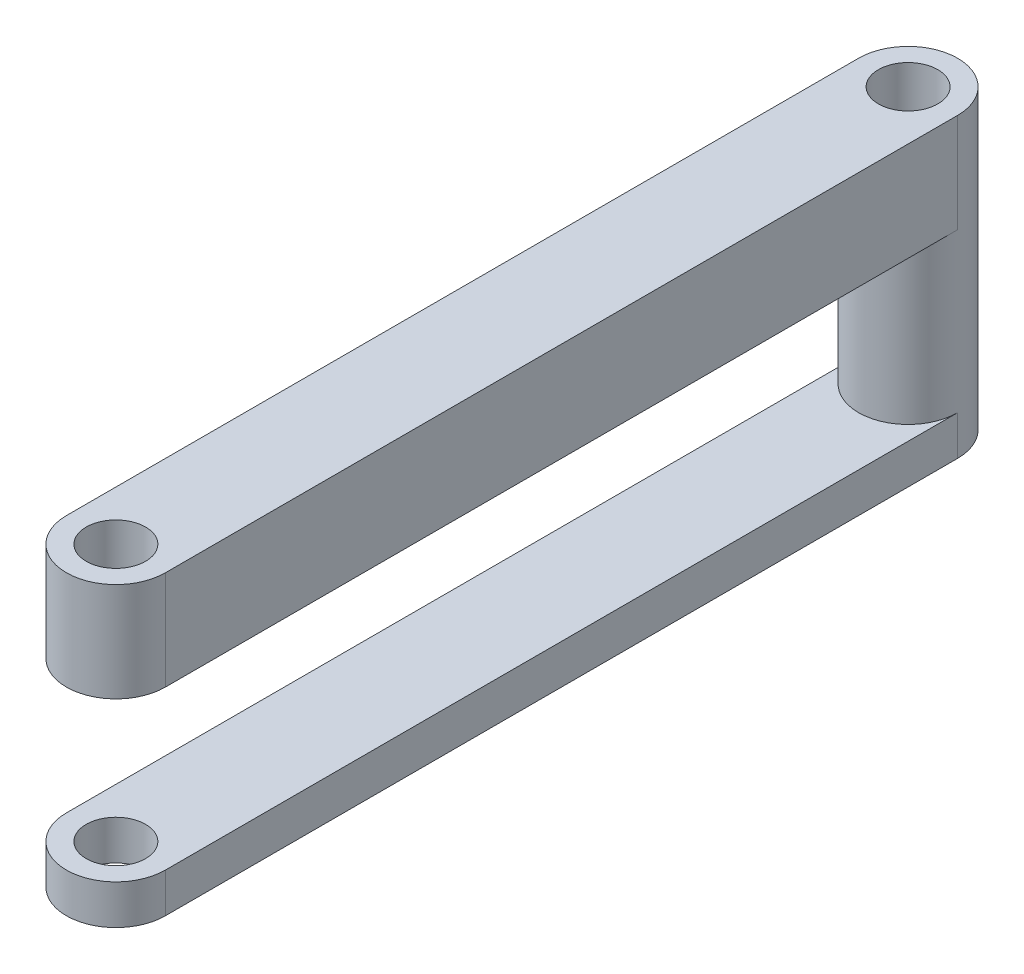
ISO-10303-21;
HEADER;
FILE_DESCRIPTION(('STEP AP214'),'2;1');
FILE_NAME('part.step','',(''),(''),'','','');
FILE_SCHEMA(('AUTOMOTIVE_DESIGN { 1 0 10303 214 1 1 1 1 }'));
ENDSEC;
DATA;
#1=APPLICATION_CONTEXT('core data for automotive mechanical design processes');
#2=APPLICATION_PROTOCOL_DEFINITION('international standard','automotive_design',2000,#1);
#3=PRODUCT_CONTEXT('',#1,'mechanical');
#4=PRODUCT('Part','Part','',(#3));
#5=PRODUCT_RELATED_PRODUCT_CATEGORY('part','',(#4));
#6=PRODUCT_DEFINITION_FORMATION('','',#4);
#7=PRODUCT_DEFINITION_CONTEXT('part definition',#1,'design');
#8=PRODUCT_DEFINITION('design','',#6,#7);
#9=PRODUCT_DEFINITION_SHAPE('','',#8);
#10=(LENGTH_UNIT() NAMED_UNIT(*) SI_UNIT(.MILLI.,.METRE.));
#11=(NAMED_UNIT(*) PLANE_ANGLE_UNIT() SI_UNIT($,.RADIAN.));
#12=(NAMED_UNIT(*) SI_UNIT($,.STERADIAN.) SOLID_ANGLE_UNIT());
#13=UNCERTAINTY_MEASURE_WITH_UNIT(LENGTH_MEASURE(1.E-05),#10,'distance_accuracy_value','');
#14=(GEOMETRIC_REPRESENTATION_CONTEXT(3) GLOBAL_UNCERTAINTY_ASSIGNED_CONTEXT((#13)) GLOBAL_UNIT_ASSIGNED_CONTEXT((#10,
#11,#12)) REPRESENTATION_CONTEXT('',''));
#15=CARTESIAN_POINT('',(0.,0.,0.));
#16=DIRECTION('',(0.,0.,1.));
#17=DIRECTION('',(1.,0.,0.));
#18=AXIS2_PLACEMENT_3D('',#15,#16,#17);
#19=CARTESIAN_POINT('',(0.,2.,0.));
#20=DIRECTION('',(0.,-1.,0.));
#21=DIRECTION('',(0.,0.,-1.));
#22=AXIS2_PLACEMENT_3D('',#19,#20,#21);
#23=CYLINDRICAL_SURFACE('',#22,2.5);
#24=CARTESIAN_POINT('',(0.,0.,0.));
#25=DIRECTION('',(0.,1.,0.));
#26=DIRECTION('',(0.,0.,1.));
#27=AXIS2_PLACEMENT_3D('',#24,#25,#26);
#28=CIRCLE('',#27,2.5);
#29=CARTESIAN_POINT('',(2.5,0.,0.));
#30=VERTEX_POINT('',#29);
#31=CARTESIAN_POINT('',(-2.5,0.,0.));
#32=VERTEX_POINT('',#31);
#33=EDGE_CURVE('E112',#30,#32,#28,.T.);
#34=ORIENTED_EDGE('',*,*,#33,.T.);
#35=DIRECTION('',(0.,-1.,0.));
#36=VECTOR('',#35,1.);
#37=CARTESIAN_POINT('',(-2.5,2.,0.));
#38=LINE('',#37,#36);
#39=CARTESIAN_POINT('',(-2.5,2.,0.));
#40=VERTEX_POINT('',#39);
#41=EDGE_CURVE('E123',#40,#32,#38,.T.);
#42=ORIENTED_EDGE('',*,*,#41,.F.);
#43=CARTESIAN_POINT('',(0.,2.,0.));
#44=DIRECTION('',(0.,1.,0.));
#45=DIRECTION('',(0.,0.,1.));
#46=AXIS2_PLACEMENT_3D('',#43,#44,#45);
#47=CIRCLE('',#46,2.5);
#48=CARTESIAN_POINT('',(2.5,2.,0.));
#49=VERTEX_POINT('',#48);
#50=EDGE_CURVE('E41',#40,#49,#47,.T.);
#51=ORIENTED_EDGE('',*,*,#50,.T.);
#52=DIRECTION('',(0.,-1.,0.));
#53=VECTOR('',#52,1.);
#54=CARTESIAN_POINT('',(2.5,2.,0.));
#55=LINE('',#54,#53);
#56=EDGE_CURVE('E131',#49,#30,#55,.T.);
#57=ORIENTED_EDGE('',*,*,#56,.T.);
#58=EDGE_LOOP('',(#34,#42,#51,#57));
#59=FACE_BOUND('',#58,.T.);
#60=CARTESIAN_POINT('',(0.,10.,0.));
#61=DIRECTION('',(0.,1.,0.));
#62=DIRECTION('',(0.,0.,1.));
#63=AXIS2_PLACEMENT_3D('',#60,#61,#62);
#64=CIRCLE('',#63,2.5);
#65=CARTESIAN_POINT('',(-2.5,10.,0.));
#66=VERTEX_POINT('',#65);
#67=CARTESIAN_POINT('',(2.5,10.,0.));
#68=VERTEX_POINT('',#67);
#69=EDGE_CURVE('E11',#66,#68,#64,.T.);
#70=ORIENTED_EDGE('',*,*,#69,.F.);
#71=DIRECTION('',(0.,-1.,0.));
#72=VECTOR('',#71,1.);
#73=CARTESIAN_POINT('',(-2.5,15.,0.));
#74=LINE('',#73,#72);
#75=CARTESIAN_POINT('',(-2.5,15.,0.));
#76=VERTEX_POINT('',#75);
#77=EDGE_CURVE('E55',#76,#66,#74,.T.);
#78=ORIENTED_EDGE('',*,*,#77,.F.);
#79=CARTESIAN_POINT('',(0.,15.,0.));
#80=DIRECTION('',(0.,1.,0.));
#81=DIRECTION('',(0.,0.,1.));
#82=AXIS2_PLACEMENT_3D('',#79,#80,#81);
#83=CIRCLE('',#82,2.5);
#84=CARTESIAN_POINT('',(2.5,15.,0.));
#85=VERTEX_POINT('',#84);
#86=EDGE_CURVE('E103',#85,#76,#83,.T.);
#87=ORIENTED_EDGE('',*,*,#86,.F.);
#88=DIRECTION('',(0.,-1.,0.));
#89=VECTOR('',#88,1.);
#90=CARTESIAN_POINT('',(2.5,15.,0.));
#91=LINE('',#90,#89);
#92=EDGE_CURVE('E48',#85,#68,#91,.T.);
#93=ORIENTED_EDGE('',*,*,#92,.T.);
#94=EDGE_LOOP('',(#70,#78,#87,#93));
#95=FACE_BOUND('',#94,.T.);
#96=ADVANCED_FACE('F33',(#59,#95),#23,.T.);
#97=CARTESIAN_POINT('',(-2.5,2.,0.));
#98=DIRECTION('',(1.,0.,0.));
#99=DIRECTION('',(0.,0.,-1.));
#100=AXIS2_PLACEMENT_3D('',#97,#98,#99);
#101=PLANE('',#100);
#102=DIRECTION('',(0.,0.,1.));
#103=VECTOR('',#102,1.);
#104=CARTESIAN_POINT('',(-2.5,0.,0.));
#105=LINE('',#104,#103);
#106=CARTESIAN_POINT('',(-2.5,0.,40.));
#107=VERTEX_POINT('',#106);
#108=EDGE_CURVE('E115',#32,#107,#105,.T.);
#109=ORIENTED_EDGE('',*,*,#108,.T.);
#110=DIRECTION('',(0.,-1.,0.));
#111=VECTOR('',#110,1.);
#112=CARTESIAN_POINT('',(-2.5,2.,40.));
#113=LINE('',#112,#111);
#114=CARTESIAN_POINT('',(-2.5,2.,40.));
#115=VERTEX_POINT('',#114);
#116=EDGE_CURVE('E142',#115,#107,#113,.T.);
#117=ORIENTED_EDGE('',*,*,#116,.F.);
#118=DIRECTION('',(0.,0.,1.));
#119=VECTOR('',#118,1.);
#120=CARTESIAN_POINT('',(-2.5,2.,0.));
#121=LINE('',#120,#119);
#122=EDGE_CURVE('E124',#40,#115,#121,.T.);
#123=ORIENTED_EDGE('',*,*,#122,.F.);
#124=ORIENTED_EDGE('',*,*,#41,.T.);
#125=EDGE_LOOP('',(#109,#117,#123,#124));
#126=FACE_BOUND('',#125,.T.);
#127=ADVANCED_FACE('F149',(#126),#101,.F.);
#128=CARTESIAN_POINT('',(0.,2.,40.));
#129=DIRECTION('',(0.,-1.,0.));
#130=DIRECTION('',(0.,0.,-1.));
#131=AXIS2_PLACEMENT_3D('',#128,#129,#130);
#132=CYLINDRICAL_SURFACE('',#131,2.5);
#133=CARTESIAN_POINT('',(0.,0.,40.));
#134=DIRECTION('',(0.,1.,0.));
#135=DIRECTION('',(0.,0.,1.));
#136=AXIS2_PLACEMENT_3D('',#133,#134,#135);
#137=CIRCLE('',#136,2.5);
#138=CARTESIAN_POINT('',(2.5,0.,40.));
#139=VERTEX_POINT('',#138);
#140=EDGE_CURVE('E134',#107,#139,#137,.T.);
#141=ORIENTED_EDGE('',*,*,#140,.T.);
#142=DIRECTION('',(0.,-1.,0.));
#143=VECTOR('',#142,1.);
#144=CARTESIAN_POINT('',(2.5,2.,40.));
#145=LINE('',#144,#143);
#146=CARTESIAN_POINT('',(2.5,2.,40.));
#147=VERTEX_POINT('',#146);
#148=EDGE_CURVE('E140',#147,#139,#145,.T.);
#149=ORIENTED_EDGE('',*,*,#148,.F.);
#150=CARTESIAN_POINT('',(0.,2.,40.));
#151=DIRECTION('',(0.,1.,0.));
#152=DIRECTION('',(0.,0.,1.));
#153=AXIS2_PLACEMENT_3D('',#150,#151,#152);
#154=CIRCLE('',#153,2.5);
#155=EDGE_CURVE('E126',#115,#147,#154,.T.);
#156=ORIENTED_EDGE('',*,*,#155,.F.);
#157=ORIENTED_EDGE('',*,*,#116,.T.);
#158=EDGE_LOOP('',(#141,#149,#156,#157));
#159=FACE_BOUND('',#158,.T.);
#160=ADVANCED_FACE('F163',(#159),#132,.T.);
#161=CARTESIAN_POINT('',(2.5,2.,0.));
#162=DIRECTION('',(1.,0.,0.));
#163=DIRECTION('',(0.,0.,-1.));
#164=AXIS2_PLACEMENT_3D('',#161,#162,#163);
#165=PLANE('',#164);
#166=DIRECTION('',(0.,0.,1.));
#167=VECTOR('',#166,1.);
#168=CARTESIAN_POINT('',(2.5,0.,0.));
#169=LINE('',#168,#167);
#170=EDGE_CURVE('E127',#30,#139,#169,.T.);
#171=ORIENTED_EDGE('',*,*,#170,.F.);
#172=ORIENTED_EDGE('',*,*,#56,.F.);
#173=DIRECTION('',(0.,0.,1.));
#174=VECTOR('',#173,1.);
#175=CARTESIAN_POINT('',(2.5,2.,0.));
#176=LINE('',#175,#174);
#177=EDGE_CURVE('E129',#49,#147,#176,.T.);
#178=ORIENTED_EDGE('',*,*,#177,.T.);
#179=ORIENTED_EDGE('',*,*,#148,.T.);
#180=EDGE_LOOP('',(#171,#172,#178,#179));
#181=FACE_BOUND('',#180,.T.);
#182=ADVANCED_FACE('F159',(#181),#165,.T.);
#183=CARTESIAN_POINT('',(0.,2.,0.));
#184=DIRECTION('',(0.,1.,0.));
#185=DIRECTION('',(0.,0.,1.));
#186=AXIS2_PLACEMENT_3D('',#183,#184,#185);
#187=PLANE('',#186);
#188=CARTESIAN_POINT('',(0.,2.,40.));
#189=DIRECTION('',(0.,1.,0.));
#190=DIRECTION('',(0.,0.,1.));
#191=AXIS2_PLACEMENT_3D('',#188,#189,#190);
#192=CIRCLE('',#191,1.5);
#193=CARTESIAN_POINT('',(0.,2.,41.5));
#194=VERTEX_POINT('',#193);
#195=EDGE_CURVE('E307',#194,#194,#192,.T.);
#196=ORIENTED_EDGE('',*,*,#195,.F.);
#197=EDGE_LOOP('',(#196));
#198=FACE_BOUND('',#197,.T.);
#199=ORIENTED_EDGE('',*,*,#50,.F.);
#200=ORIENTED_EDGE('',*,*,#122,.T.);
#201=ORIENTED_EDGE('',*,*,#155,.T.);
#202=ORIENTED_EDGE('',*,*,#177,.F.);
#203=EDGE_LOOP('',(#199,#200,#201,#202));
#204=FACE_BOUND('',#203,.T.);
#205=ADVANCED_FACE('F165',(#198,#204),#187,.T.);
#206=CARTESIAN_POINT('',(0.,0.,0.));
#207=DIRECTION('',(0.,1.,0.));
#208=DIRECTION('',(0.,0.,1.));
#209=AXIS2_PLACEMENT_3D('',#206,#207,#208);
#210=PLANE('',#209);
#211=CARTESIAN_POINT('',(0.,0.,0.));
#212=DIRECTION('',(0.,1.,0.));
#213=DIRECTION('',(0.,0.,1.));
#214=AXIS2_PLACEMENT_3D('',#211,#212,#213);
#215=CIRCLE('',#214,1.5);
#216=CARTESIAN_POINT('',(0.,0.,1.5));
#217=VERTEX_POINT('',#216);
#218=EDGE_CURVE('E294',#217,#217,#215,.T.);
#219=ORIENTED_EDGE('',*,*,#218,.T.);
#220=EDGE_LOOP('',(#219));
#221=FACE_BOUND('',#220,.T.);
#222=CARTESIAN_POINT('',(0.,0.,40.));
#223=DIRECTION('',(0.,1.,0.));
#224=DIRECTION('',(0.,0.,1.));
#225=AXIS2_PLACEMENT_3D('',#222,#223,#224);
#226=CIRCLE('',#225,1.5);
#227=CARTESIAN_POINT('',(0.,0.,41.5));
#228=VERTEX_POINT('',#227);
#229=EDGE_CURVE('E304',#228,#228,#226,.T.);
#230=ORIENTED_EDGE('',*,*,#229,.T.);
#231=EDGE_LOOP('',(#230));
#232=FACE_BOUND('',#231,.T.);
#233=ORIENTED_EDGE('',*,*,#33,.F.);
#234=ORIENTED_EDGE('',*,*,#170,.T.);
#235=ORIENTED_EDGE('',*,*,#140,.F.);
#236=ORIENTED_EDGE('',*,*,#108,.F.);
#237=EDGE_LOOP('',(#233,#234,#235,#236));
#238=FACE_BOUND('',#237,.T.);
#239=ADVANCED_FACE('F156',(#221,#232,#238),#210,.F.);
#240=CARTESIAN_POINT('',(-2.5,15.,0.));
#241=DIRECTION('',(1.,0.,0.));
#242=DIRECTION('',(0.,0.,-1.));
#243=AXIS2_PLACEMENT_3D('',#240,#241,#242);
#244=PLANE('',#243);
#245=DIRECTION('',(0.,0.,1.));
#246=VECTOR('',#245,1.);
#247=CARTESIAN_POINT('',(-2.5,10.,0.));
#248=LINE('',#247,#246);
#249=CARTESIAN_POINT('',(-2.5,10.,40.));
#250=VERTEX_POINT('',#249);
#251=EDGE_CURVE('E309',#66,#250,#248,.T.);
#252=ORIENTED_EDGE('',*,*,#251,.T.);
#253=DIRECTION('',(0.,-1.,0.));
#254=VECTOR('',#253,1.);
#255=CARTESIAN_POINT('',(-2.5,15.,40.));
#256=LINE('',#255,#254);
#257=CARTESIAN_POINT('',(-2.5,15.,40.));
#258=VERTEX_POINT('',#257);
#259=EDGE_CURVE('E99',#258,#250,#256,.T.);
#260=ORIENTED_EDGE('',*,*,#259,.F.);
#261=DIRECTION('',(0.,0.,1.));
#262=VECTOR('',#261,1.);
#263=CARTESIAN_POINT('',(-2.5,15.,0.));
#264=LINE('',#263,#262);
#265=EDGE_CURVE('E95',#76,#258,#264,.T.);
#266=ORIENTED_EDGE('',*,*,#265,.F.);
#267=ORIENTED_EDGE('',*,*,#77,.T.);
#268=EDGE_LOOP('',(#252,#260,#266,#267));
#269=FACE_BOUND('',#268,.T.);
#270=ADVANCED_FACE('F97',(#269),#244,.F.);
#271=CARTESIAN_POINT('',(0.,15.,40.));
#272=DIRECTION('',(0.,-1.,0.));
#273=DIRECTION('',(0.,0.,-1.));
#274=AXIS2_PLACEMENT_3D('',#271,#272,#273);
#275=CYLINDRICAL_SURFACE('',#274,2.5);
#276=CARTESIAN_POINT('',(0.,10.,40.));
#277=DIRECTION('',(0.,1.,0.));
#278=DIRECTION('',(0.,0.,1.));
#279=AXIS2_PLACEMENT_3D('',#276,#277,#278);
#280=CIRCLE('',#279,2.5);
#281=CARTESIAN_POINT('',(2.5,10.,40.));
#282=VERTEX_POINT('',#281);
#283=EDGE_CURVE('E314',#250,#282,#280,.T.);
#284=ORIENTED_EDGE('',*,*,#283,.T.);
#285=DIRECTION('',(0.,-1.,0.));
#286=VECTOR('',#285,1.);
#287=CARTESIAN_POINT('',(2.5,15.,40.));
#288=LINE('',#287,#286);
#289=CARTESIAN_POINT('',(2.5,15.,40.));
#290=VERTEX_POINT('',#289);
#291=EDGE_CURVE('E117',#290,#282,#288,.T.);
#292=ORIENTED_EDGE('',*,*,#291,.F.);
#293=CARTESIAN_POINT('',(0.,15.,40.));
#294=DIRECTION('',(0.,1.,0.));
#295=DIRECTION('',(0.,0.,1.));
#296=AXIS2_PLACEMENT_3D('',#293,#294,#295);
#297=CIRCLE('',#296,2.5);
#298=EDGE_CURVE('E102',#258,#290,#297,.T.);
#299=ORIENTED_EDGE('',*,*,#298,.F.);
#300=ORIENTED_EDGE('',*,*,#259,.T.);
#301=EDGE_LOOP('',(#284,#292,#299,#300));
#302=FACE_BOUND('',#301,.T.);
#303=ADVANCED_FACE('F211',(#302),#275,.T.);
#304=CARTESIAN_POINT('',(2.5,15.,0.));
#305=DIRECTION('',(-1.,0.,0.));
#306=DIRECTION('',(0.,0.,1.));
#307=AXIS2_PLACEMENT_3D('',#304,#305,#306);
#308=PLANE('',#307);
#309=DIRECTION('',(0.,0.,-1.));
#310=VECTOR('',#309,1.);
#311=CARTESIAN_POINT('',(2.5,10.,0.));
#312=LINE('',#311,#310);
#313=EDGE_CURVE('E109',#282,#68,#312,.T.);
#314=ORIENTED_EDGE('',*,*,#313,.T.);
#315=ORIENTED_EDGE('',*,*,#92,.F.);
#316=DIRECTION('',(0.,0.,-1.));
#317=VECTOR('',#316,1.);
#318=CARTESIAN_POINT('',(2.5,15.,0.));
#319=LINE('',#318,#317);
#320=EDGE_CURVE('E108',#290,#85,#319,.T.);
#321=ORIENTED_EDGE('',*,*,#320,.F.);
#322=ORIENTED_EDGE('',*,*,#291,.T.);
#323=EDGE_LOOP('',(#314,#315,#321,#322));
#324=FACE_BOUND('',#323,.T.);
#325=ADVANCED_FACE('F219',(#324),#308,.F.);
#326=CARTESIAN_POINT('',(0.,15.,0.));
#327=DIRECTION('',(0.,1.,0.));
#328=DIRECTION('',(0.,0.,1.));
#329=AXIS2_PLACEMENT_3D('',#326,#327,#328);
#330=PLANE('',#329);
#331=CARTESIAN_POINT('',(0.,15.,0.));
#332=DIRECTION('',(0.,1.,0.));
#333=DIRECTION('',(0.,0.,1.));
#334=AXIS2_PLACEMENT_3D('',#331,#332,#333);
#335=CIRCLE('',#334,1.5);
#336=CARTESIAN_POINT('',(0.,15.,1.5));
#337=VERTEX_POINT('',#336);
#338=EDGE_CURVE('E297',#337,#337,#335,.T.);
#339=ORIENTED_EDGE('',*,*,#338,.F.);
#340=EDGE_LOOP('',(#339));
#341=FACE_BOUND('',#340,.T.);
#342=CARTESIAN_POINT('',(0.,15.,40.));
#343=DIRECTION('',(0.,1.,0.));
#344=DIRECTION('',(0.,0.,1.));
#345=AXIS2_PLACEMENT_3D('',#342,#343,#344);
#346=CIRCLE('',#345,1.5);
#347=CARTESIAN_POINT('',(0.,15.,41.5));
#348=VERTEX_POINT('',#347);
#349=EDGE_CURVE('E299',#348,#348,#346,.T.);
#350=ORIENTED_EDGE('',*,*,#349,.F.);
#351=EDGE_LOOP('',(#350));
#352=FACE_BOUND('',#351,.T.);
#353=ORIENTED_EDGE('',*,*,#86,.T.);
#354=ORIENTED_EDGE('',*,*,#265,.T.);
#355=ORIENTED_EDGE('',*,*,#298,.T.);
#356=ORIENTED_EDGE('',*,*,#320,.T.);
#357=EDGE_LOOP('',(#353,#354,#355,#356));
#358=FACE_BOUND('',#357,.T.);
#359=ADVANCED_FACE('F106',(#341,#352,#358),#330,.T.);
#360=CARTESIAN_POINT('',(0.,10.,0.));
#361=DIRECTION('',(0.,1.,0.));
#362=DIRECTION('',(0.,0.,1.));
#363=AXIS2_PLACEMENT_3D('',#360,#361,#362);
#364=PLANE('',#363);
#365=CARTESIAN_POINT('',(0.,10.,40.));
#366=DIRECTION('',(0.,1.,0.));
#367=DIRECTION('',(0.,0.,1.));
#368=AXIS2_PLACEMENT_3D('',#365,#366,#367);
#369=CIRCLE('',#368,1.5);
#370=CARTESIAN_POINT('',(0.,10.,41.5));
#371=VERTEX_POINT('',#370);
#372=EDGE_CURVE('E36',#371,#371,#369,.T.);
#373=ORIENTED_EDGE('',*,*,#372,.T.);
#374=EDGE_LOOP('',(#373));
#375=FACE_BOUND('',#374,.T.);
#376=ORIENTED_EDGE('',*,*,#251,.F.);
#377=ORIENTED_EDGE('',*,*,#69,.T.);
#378=ORIENTED_EDGE('',*,*,#313,.F.);
#379=ORIENTED_EDGE('',*,*,#283,.F.);
#380=EDGE_LOOP('',(#376,#377,#378,#379));
#381=FACE_BOUND('',#380,.T.);
#382=ADVANCED_FACE('F248',(#375,#381),#364,.F.);
#383=CARTESIAN_POINT('',(0.,15.,40.));
#384=DIRECTION('',(0.,1.,0.));
#385=DIRECTION('',(0.,0.,1.));
#386=AXIS2_PLACEMENT_3D('',#383,#384,#385);
#387=CYLINDRICAL_SURFACE('',#386,1.5);
#388=ORIENTED_EDGE('',*,*,#349,.T.);
#389=EDGE_LOOP('',(#388));
#390=FACE_BOUND('',#389,.T.);
#391=ORIENTED_EDGE('',*,*,#372,.F.);
#392=EDGE_LOOP('',(#391));
#393=FACE_BOUND('',#392,.T.);
#394=ADVANCED_FACE('F258',(#390,#393),#387,.F.);
#395=ORIENTED_EDGE('',*,*,#195,.T.);
#396=EDGE_LOOP('',(#395));
#397=FACE_BOUND('',#396,.T.);
#398=ORIENTED_EDGE('',*,*,#229,.F.);
#399=EDGE_LOOP('',(#398));
#400=FACE_BOUND('',#399,.T.);
#401=ADVANCED_FACE('F268',(#397,#400),#387,.F.);
#402=CARTESIAN_POINT('',(0.,15.,0.));
#403=DIRECTION('',(0.,1.,0.));
#404=DIRECTION('',(0.,0.,1.));
#405=AXIS2_PLACEMENT_3D('',#402,#403,#404);
#406=CYLINDRICAL_SURFACE('',#405,1.5);
#407=ORIENTED_EDGE('',*,*,#218,.F.);
#408=EDGE_LOOP('',(#407));
#409=FACE_BOUND('',#408,.T.);
#410=ORIENTED_EDGE('',*,*,#338,.T.);
#411=EDGE_LOOP('',(#410));
#412=FACE_BOUND('',#411,.T.);
#413=ADVANCED_FACE('F278',(#409,#412),#406,.F.);
#414=CLOSED_SHELL('',(#96,#127,#160,#182,#205,#239,#270,#303,#325,#359,#382,#394,#401,#413));
#415=MANIFOLD_SOLID_BREP('B2',#414);
#416=ADVANCED_BREP_SHAPE_REPRESENTATION('',(#18,#415),#14);
#417=SHAPE_DEFINITION_REPRESENTATION(#9,#416);
ENDSEC;
END-ISO-10303-21;
